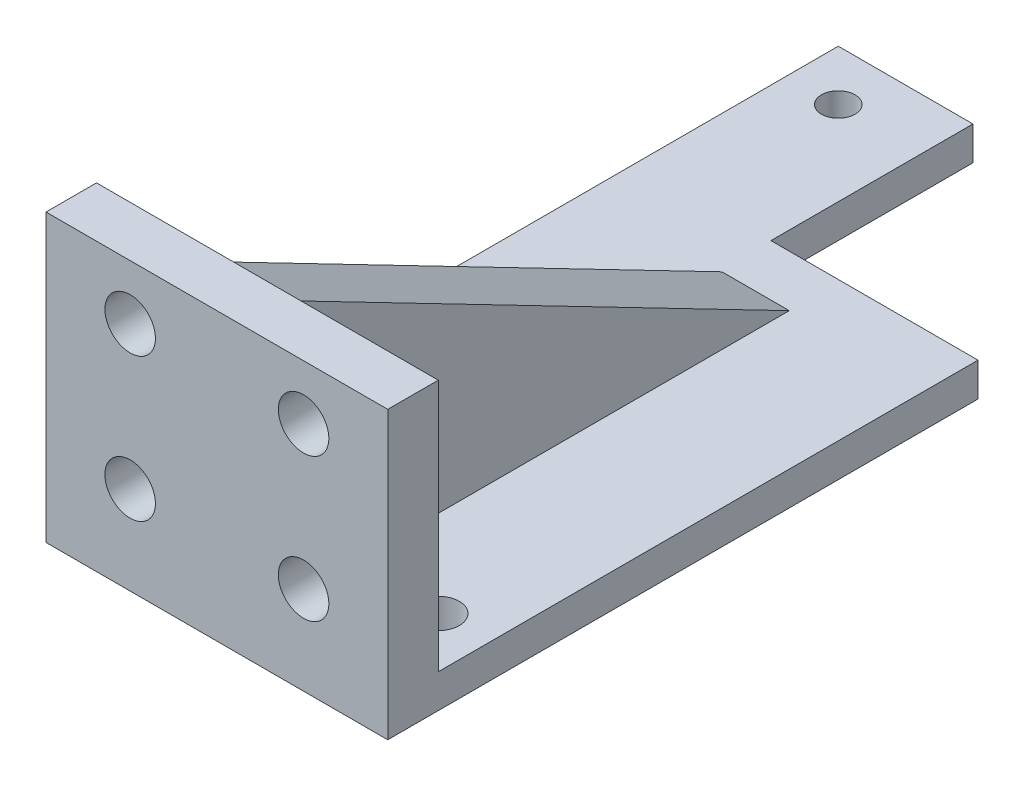
ISO-10303-21;
HEADER;
FILE_DESCRIPTION(('STEP AP214'),'2;1');
FILE_NAME('part.step','',(''),(''),'','','');
FILE_SCHEMA(('AUTOMOTIVE_DESIGN { 1 0 10303 214 1 1 1 1 }'));
ENDSEC;
DATA;
#1=APPLICATION_CONTEXT('core data for automotive mechanical design processes');
#2=APPLICATION_PROTOCOL_DEFINITION('international standard','automotive_design',2000,#1);
#3=PRODUCT_CONTEXT('',#1,'mechanical');
#4=PRODUCT('Part','Part','',(#3));
#5=PRODUCT_RELATED_PRODUCT_CATEGORY('part','',(#4));
#6=PRODUCT_DEFINITION_FORMATION('','',#4);
#7=PRODUCT_DEFINITION_CONTEXT('part definition',#1,'design');
#8=PRODUCT_DEFINITION('design','',#6,#7);
#9=PRODUCT_DEFINITION_SHAPE('','',#8);
#10=(LENGTH_UNIT() NAMED_UNIT(*) SI_UNIT(.MILLI.,.METRE.));
#11=(NAMED_UNIT(*) PLANE_ANGLE_UNIT() SI_UNIT($,.RADIAN.));
#12=(NAMED_UNIT(*) SI_UNIT($,.STERADIAN.) SOLID_ANGLE_UNIT());
#13=UNCERTAINTY_MEASURE_WITH_UNIT(LENGTH_MEASURE(1.E-05),#10,'distance_accuracy_value','');
#14=(GEOMETRIC_REPRESENTATION_CONTEXT(3) GLOBAL_UNCERTAINTY_ASSIGNED_CONTEXT((#13)) GLOBAL_UNIT_ASSIGNED_CONTEXT((#10,
#11,#12)) REPRESENTATION_CONTEXT('',''));
#15=CARTESIAN_POINT('',(0.,0.,0.));
#16=DIRECTION('',(0.,0.,1.));
#17=DIRECTION('',(1.,0.,0.));
#18=AXIS2_PLACEMENT_3D('',#15,#16,#17);
#19=CARTESIAN_POINT('',(0.,2.,0.));
#20=DIRECTION('',(0.,1.,0.));
#21=DIRECTION('',(0.,0.,1.));
#22=AXIS2_PLACEMENT_3D('',#19,#20,#21);
#23=PLANE('',#22);
#24=CARTESIAN_POINT('',(17.3,2.,-6.));
#25=DIRECTION('',(0.,1.,0.));
#26=DIRECTION('',(0.,0.,1.));
#27=AXIS2_PLACEMENT_3D('',#24,#25,#26);
#28=CIRCLE('',#27,1.25);
#29=CARTESIAN_POINT('',(17.3,2.,-4.75));
#30=VERTEX_POINT('',#29);
#31=EDGE_CURVE('E172',#30,#30,#28,.T.);
#32=ORIENTED_EDGE('',*,*,#31,.F.);
#33=EDGE_LOOP('',(#32));
#34=FACE_BOUND('',#33,.T.);
#35=CARTESIAN_POINT('',(3.,2.,-44.06));
#36=DIRECTION('',(0.,1.,0.));
#37=DIRECTION('',(0.,0.,1.));
#38=AXIS2_PLACEMENT_3D('',#35,#36,#37);
#39=CIRCLE('',#38,1.);
#40=CARTESIAN_POINT('',(3.,2.,-43.06));
#41=VERTEX_POINT('',#40);
#42=EDGE_CURVE('E212',#41,#41,#39,.T.);
#43=ORIENTED_EDGE('',*,*,#42,.F.);
#44=EDGE_LOOP('',(#43));
#45=FACE_BOUND('',#44,.T.);
#46=DIRECTION('',(1.,0.,0.));
#47=VECTOR('',#46,1.);
#48=CARTESIAN_POINT('',(0.,2.,-3.));
#49=LINE('',#48,#47);
#50=CARTESIAN_POINT('',(0.,2.,-3.));
#51=VERTEX_POINT('',#50);
#52=CARTESIAN_POINT('',(8.15,2.,-3.));
#53=VERTEX_POINT('',#52);
#54=EDGE_CURVE('E201',#51,#53,#49,.T.);
#55=ORIENTED_EDGE('',*,*,#54,.T.);
#56=DIRECTION('',(0.,0.,1.));
#57=VECTOR('',#56,1.);
#58=CARTESIAN_POINT('',(8.15,2.,-3.));
#59=LINE('',#58,#57);
#60=CARTESIAN_POINT('',(8.15,2.,-32.0005088874879));
#61=VERTEX_POINT('',#60);
#62=EDGE_CURVE('E62',#61,#53,#59,.T.);
#63=ORIENTED_EDGE('',*,*,#62,.F.);
#64=DIRECTION('',(1.,0.,0.));
#65=VECTOR('',#64,1.);
#66=CARTESIAN_POINT('',(8.15,2.,-32.0005088874879));
#67=LINE('',#66,#65);
#68=CARTESIAN_POINT('',(12.15,2.,-32.0005088874879));
#69=VERTEX_POINT('',#68);
#70=EDGE_CURVE('E67',#61,#69,#67,.T.);
#71=ORIENTED_EDGE('',*,*,#70,.T.);
#72=DIRECTION('',(0.,0.,1.));
#73=VECTOR('',#72,1.);
#74=CARTESIAN_POINT('',(12.15,2.,-3.));
#75=LINE('',#74,#73);
#76=CARTESIAN_POINT('',(12.15,2.,-3.));
#77=VERTEX_POINT('',#76);
#78=EDGE_CURVE('E153',#69,#77,#75,.T.);
#79=ORIENTED_EDGE('',*,*,#78,.T.);
#80=CARTESIAN_POINT('',(20.3,2.,-3.));
#81=VERTEX_POINT('',#80);
#82=EDGE_CURVE('E149',#77,#81,#49,.T.);
#83=ORIENTED_EDGE('',*,*,#82,.T.);
#84=DIRECTION('',(0.,0.,-1.));
#85=VECTOR('',#84,1.);
#86=CARTESIAN_POINT('',(20.3,2.,0.));
#87=LINE('',#86,#85);
#88=CARTESIAN_POINT('',(20.3,2.,-35.06));
#89=VERTEX_POINT('',#88);
#90=EDGE_CURVE('E221',#81,#89,#87,.T.);
#91=ORIENTED_EDGE('',*,*,#90,.T.);
#92=DIRECTION('',(1.,0.,0.));
#93=VECTOR('',#92,1.);
#94=CARTESIAN_POINT('',(0.,2.,-35.06));
#95=LINE('',#94,#93);
#96=CARTESIAN_POINT('',(8.,2.,-35.06));
#97=VERTEX_POINT('',#96);
#98=EDGE_CURVE('E223',#97,#89,#95,.T.);
#99=ORIENTED_EDGE('',*,*,#98,.F.);
#100=DIRECTION('',(0.,0.,1.));
#101=VECTOR('',#100,1.);
#102=CARTESIAN_POINT('',(8.00000000000001,2.,0.));
#103=LINE('',#102,#101);
#104=CARTESIAN_POINT('',(8.,2.,-47.06));
#105=VERTEX_POINT('',#104);
#106=EDGE_CURVE('E226',#105,#97,#103,.T.);
#107=ORIENTED_EDGE('',*,*,#106,.F.);
#108=DIRECTION('',(1.,0.,0.));
#109=VECTOR('',#108,1.);
#110=CARTESIAN_POINT('',(0.,2.,-47.06));
#111=LINE('',#110,#109);
#112=CARTESIAN_POINT('',(0.,2.,-47.06));
#113=VERTEX_POINT('',#112);
#114=EDGE_CURVE('E215',#113,#105,#111,.T.);
#115=ORIENTED_EDGE('',*,*,#114,.F.);
#116=DIRECTION('',(0.,0.,-1.));
#117=VECTOR('',#116,1.);
#118=CARTESIAN_POINT('',(0.,2.,0.));
#119=LINE('',#118,#117);
#120=EDGE_CURVE('E219',#51,#113,#119,.T.);
#121=ORIENTED_EDGE('',*,*,#120,.F.);
#122=EDGE_LOOP('',(#55,#63,#71,#79,#83,#91,#99,#107,#115,#121));
#123=FACE_BOUND('',#122,.T.);
#124=ADVANCED_FACE('F47',(#34,#45,#123),#23,.T.);
#125=CARTESIAN_POINT('',(0.,17.,-3.));
#126=DIRECTION('',(0.,0.,-1.));
#127=DIRECTION('',(-1.,0.,0.));
#128=AXIS2_PLACEMENT_3D('',#125,#126,#127);
#129=PLANE('',#128);
#130=CARTESIAN_POINT('',(5.,5.25,-3.));
#131=DIRECTION('',(0.,0.,-1.));
#132=DIRECTION('',(1.,0.,0.));
#133=AXIS2_PLACEMENT_3D('',#130,#131,#132);
#134=CIRCLE('',#133,1.5);
#135=CARTESIAN_POINT('',(6.5,5.25,-3.));
#136=VERTEX_POINT('',#135);
#137=EDGE_CURVE('E175',#136,#136,#134,.T.);
#138=ORIENTED_EDGE('',*,*,#137,.F.);
#139=EDGE_LOOP('',(#138));
#140=FACE_BOUND('',#139,.T.);
#141=CARTESIAN_POINT('',(5.,13.75,-3.));
#142=DIRECTION('',(0.,0.,-1.));
#143=DIRECTION('',(-1.,0.,0.));
#144=AXIS2_PLACEMENT_3D('',#141,#142,#143);
#145=CIRCLE('',#144,1.5);
#146=CARTESIAN_POINT('',(3.5,13.75,-3.));
#147=VERTEX_POINT('',#146);
#148=EDGE_CURVE('E178',#147,#147,#145,.T.);
#149=ORIENTED_EDGE('',*,*,#148,.F.);
#150=EDGE_LOOP('',(#149));
#151=FACE_BOUND('',#150,.T.);
#152=DIRECTION('',(1.,0.,0.));
#153=VECTOR('',#152,1.);
#154=CARTESIAN_POINT('',(0.,17.,-3.));
#155=LINE('',#154,#153);
#156=CARTESIAN_POINT('',(0.,17.,-3.));
#157=VERTEX_POINT('',#156);
#158=CARTESIAN_POINT('',(8.15,17.,-3.));
#159=VERTEX_POINT('',#158);
#160=EDGE_CURVE('E141',#157,#159,#155,.T.);
#161=ORIENTED_EDGE('',*,*,#160,.T.);
#162=DIRECTION('',(0.,1.,0.));
#163=VECTOR('',#162,1.);
#164=CARTESIAN_POINT('',(8.15,17.,-3.));
#165=LINE('',#164,#163);
#166=EDGE_CURVE('E160',#53,#159,#165,.T.);
#167=ORIENTED_EDGE('',*,*,#166,.F.);
#168=ORIENTED_EDGE('',*,*,#54,.F.);
#169=DIRECTION('',(0.,-1.,0.));
#170=VECTOR('',#169,1.);
#171=CARTESIAN_POINT('',(0.,17.,-3.));
#172=LINE('',#171,#170);
#173=EDGE_CURVE('E206',#157,#51,#172,.T.);
#174=ORIENTED_EDGE('',*,*,#173,.F.);
#175=EDGE_LOOP('',(#161,#167,#168,#174));
#176=FACE_BOUND('',#175,.T.);
#177=ADVANCED_FACE('F285',(#140,#151,#176),#129,.T.);
#178=CARTESIAN_POINT('',(0.,2.,-47.06));
#179=DIRECTION('',(0.,0.,-1.));
#180=DIRECTION('',(-1.,0.,0.));
#181=AXIS2_PLACEMENT_3D('',#178,#179,#180);
#182=PLANE('',#181);
#183=DIRECTION('',(1.,0.,0.));
#184=VECTOR('',#183,1.);
#185=CARTESIAN_POINT('',(0.,0.,-47.06));
#186=LINE('',#185,#184);
#187=CARTESIAN_POINT('',(0.,0.,-47.06));
#188=VERTEX_POINT('',#187);
#189=CARTESIAN_POINT('',(8.,0.,-47.06));
#190=VERTEX_POINT('',#189);
#191=EDGE_CURVE('E232',#188,#190,#186,.T.);
#192=ORIENTED_EDGE('',*,*,#191,.F.);
#193=DIRECTION('',(0.,-1.,0.));
#194=VECTOR('',#193,1.);
#195=CARTESIAN_POINT('',(0.,2.,-47.06));
#196=LINE('',#195,#194);
#197=EDGE_CURVE('E11',#113,#188,#196,.T.);
#198=ORIENTED_EDGE('',*,*,#197,.F.);
#199=ORIENTED_EDGE('',*,*,#114,.T.);
#200=DIRECTION('',(0.,-1.,0.));
#201=VECTOR('',#200,1.);
#202=CARTESIAN_POINT('',(8.,2.,-47.06));
#203=LINE('',#202,#201);
#204=EDGE_CURVE('E229',#105,#190,#203,.T.);
#205=ORIENTED_EDGE('',*,*,#204,.T.);
#206=EDGE_LOOP('',(#192,#198,#199,#205));
#207=FACE_BOUND('',#206,.T.);
#208=ADVANCED_FACE('F270',(#207),#182,.T.);
#209=CARTESIAN_POINT('',(0.,2.,0.));
#210=DIRECTION('',(-1.,0.,0.));
#211=DIRECTION('',(0.,0.,1.));
#212=AXIS2_PLACEMENT_3D('',#209,#210,#211);
#213=PLANE('',#212);
#214=DIRECTION('',(0.,0.,-1.));
#215=VECTOR('',#214,1.);
#216=CARTESIAN_POINT('',(0.,0.,0.));
#217=LINE('',#216,#215);
#218=CARTESIAN_POINT('',(0.,0.,0.));
#219=VERTEX_POINT('',#218);
#220=EDGE_CURVE('E235',#219,#188,#217,.T.);
#221=ORIENTED_EDGE('',*,*,#220,.F.);
#222=DIRECTION('',(0.,-1.,0.));
#223=VECTOR('',#222,1.);
#224=CARTESIAN_POINT('',(0.,2.,0.));
#225=LINE('',#224,#223);
#226=CARTESIAN_POINT('',(0.,17.,0.));
#227=VERTEX_POINT('',#226);
#228=EDGE_CURVE('E55',#227,#219,#225,.T.);
#229=ORIENTED_EDGE('',*,*,#228,.F.);
#230=DIRECTION('',(0.,0.,-1.));
#231=VECTOR('',#230,1.);
#232=CARTESIAN_POINT('',(0.,17.,0.));
#233=LINE('',#232,#231);
#234=EDGE_CURVE('E142',#227,#157,#233,.T.);
#235=ORIENTED_EDGE('',*,*,#234,.T.);
#236=ORIENTED_EDGE('',*,*,#173,.T.);
#237=ORIENTED_EDGE('',*,*,#120,.T.);
#238=ORIENTED_EDGE('',*,*,#197,.T.);
#239=EDGE_LOOP('',(#221,#229,#235,#236,#237,#238));
#240=FACE_BOUND('',#239,.T.);
#241=ADVANCED_FACE('F264',(#240),#213,.T.);
#242=CARTESIAN_POINT('',(0.,2.,0.));
#243=DIRECTION('',(0.,0.,-1.));
#244=DIRECTION('',(-1.,0.,0.));
#245=AXIS2_PLACEMENT_3D('',#242,#243,#244);
#246=PLANE('',#245);
#247=CARTESIAN_POINT('',(15.3,5.25,0.));
#248=DIRECTION('',(0.,0.,-1.));
#249=DIRECTION('',(-1.,0.,0.));
#250=AXIS2_PLACEMENT_3D('',#247,#248,#249);
#251=CIRCLE('',#250,1.5);
#252=CARTESIAN_POINT('',(13.8,5.25,0.));
#253=VERTEX_POINT('',#252);
#254=EDGE_CURVE('E196',#253,#253,#251,.T.);
#255=ORIENTED_EDGE('',*,*,#254,.T.);
#256=EDGE_LOOP('',(#255));
#257=FACE_BOUND('',#256,.T.);
#258=CARTESIAN_POINT('',(5.,13.75,0.));
#259=DIRECTION('',(0.,0.,-1.));
#260=DIRECTION('',(-1.,0.,0.));
#261=AXIS2_PLACEMENT_3D('',#258,#259,#260);
#262=CIRCLE('',#261,1.5);
#263=CARTESIAN_POINT('',(3.5,13.75,0.));
#264=VERTEX_POINT('',#263);
#265=EDGE_CURVE('E193',#264,#264,#262,.T.);
#266=ORIENTED_EDGE('',*,*,#265,.T.);
#267=EDGE_LOOP('',(#266));
#268=FACE_BOUND('',#267,.T.);
#269=CARTESIAN_POINT('',(5.,5.25,0.));
#270=DIRECTION('',(0.,0.,-1.));
#271=DIRECTION('',(-1.,0.,0.));
#272=AXIS2_PLACEMENT_3D('',#269,#270,#271);
#273=CIRCLE('',#272,1.5);
#274=CARTESIAN_POINT('',(3.5,5.25,0.));
#275=VERTEX_POINT('',#274);
#276=EDGE_CURVE('E190',#275,#275,#273,.T.);
#277=ORIENTED_EDGE('',*,*,#276,.T.);
#278=EDGE_LOOP('',(#277));
#279=FACE_BOUND('',#278,.T.);
#280=CARTESIAN_POINT('',(15.3,13.75,0.));
#281=DIRECTION('',(0.,0.,-1.));
#282=DIRECTION('',(-1.,0.,0.));
#283=AXIS2_PLACEMENT_3D('',#280,#281,#282);
#284=CIRCLE('',#283,1.5);
#285=CARTESIAN_POINT('',(13.8,13.75,0.));
#286=VERTEX_POINT('',#285);
#287=EDGE_CURVE('E187',#286,#286,#284,.T.);
#288=ORIENTED_EDGE('',*,*,#287,.T.);
#289=EDGE_LOOP('',(#288));
#290=FACE_BOUND('',#289,.T.);
#291=DIRECTION('',(1.,0.,0.));
#292=VECTOR('',#291,1.);
#293=CARTESIAN_POINT('',(0.,0.,0.));
#294=LINE('',#293,#292);
#295=CARTESIAN_POINT('',(20.3,0.,0.));
#296=VERTEX_POINT('',#295);
#297=EDGE_CURVE('E238',#219,#296,#294,.T.);
#298=ORIENTED_EDGE('',*,*,#297,.T.);
#299=DIRECTION('',(0.,-1.,0.));
#300=VECTOR('',#299,1.);
#301=CARTESIAN_POINT('',(20.3,2.,0.));
#302=LINE('',#301,#300);
#303=CARTESIAN_POINT('',(20.3,17.,0.));
#304=VERTEX_POINT('',#303);
#305=EDGE_CURVE('E254',#304,#296,#302,.T.);
#306=ORIENTED_EDGE('',*,*,#305,.F.);
#307=DIRECTION('',(-1.,0.,0.));
#308=VECTOR('',#307,1.);
#309=CARTESIAN_POINT('',(20.3,17.,0.));
#310=LINE('',#309,#308);
#311=EDGE_CURVE('E200',#304,#227,#310,.T.);
#312=ORIENTED_EDGE('',*,*,#311,.T.);
#313=ORIENTED_EDGE('',*,*,#228,.T.);
#314=EDGE_LOOP('',(#298,#306,#312,#313));
#315=FACE_BOUND('',#314,.T.);
#316=ADVANCED_FACE('F258',(#257,#268,#279,#290,#315),#246,.F.);
#317=CARTESIAN_POINT('',(20.3,2.,0.));
#318=DIRECTION('',(-1.,0.,0.));
#319=DIRECTION('',(0.,0.,1.));
#320=AXIS2_PLACEMENT_3D('',#317,#318,#319);
#321=PLANE('',#320);
#322=DIRECTION('',(0.,0.,-1.));
#323=VECTOR('',#322,1.);
#324=CARTESIAN_POINT('',(20.3,0.,0.));
#325=LINE('',#324,#323);
#326=CARTESIAN_POINT('',(20.3,0.,-35.06));
#327=VERTEX_POINT('',#326);
#328=EDGE_CURVE('E241',#296,#327,#325,.T.);
#329=ORIENTED_EDGE('',*,*,#328,.T.);
#330=DIRECTION('',(0.,-1.,0.));
#331=VECTOR('',#330,1.);
#332=CARTESIAN_POINT('',(20.3,2.,-35.06));
#333=LINE('',#332,#331);
#334=EDGE_CURVE('E252',#89,#327,#333,.T.);
#335=ORIENTED_EDGE('',*,*,#334,.F.);
#336=ORIENTED_EDGE('',*,*,#90,.F.);
#337=DIRECTION('',(0.,-1.,0.));
#338=VECTOR('',#337,1.);
#339=CARTESIAN_POINT('',(20.3,17.,-3.));
#340=LINE('',#339,#338);
#341=CARTESIAN_POINT('',(20.3,17.,-3.));
#342=VERTEX_POINT('',#341);
#343=EDGE_CURVE('E208',#342,#81,#340,.T.);
#344=ORIENTED_EDGE('',*,*,#343,.F.);
#345=DIRECTION('',(0.,0.,1.));
#346=VECTOR('',#345,1.);
#347=CARTESIAN_POINT('',(20.3,17.,-3.));
#348=LINE('',#347,#346);
#349=EDGE_CURVE('E137',#342,#304,#348,.T.);
#350=ORIENTED_EDGE('',*,*,#349,.T.);
#351=ORIENTED_EDGE('',*,*,#305,.T.);
#352=EDGE_LOOP('',(#329,#335,#336,#344,#350,#351));
#353=FACE_BOUND('',#352,.T.);
#354=ADVANCED_FACE('F282',(#353),#321,.F.);
#355=CARTESIAN_POINT('',(0.,2.,-35.06));
#356=DIRECTION('',(0.,0.,-1.));
#357=DIRECTION('',(-1.,0.,0.));
#358=AXIS2_PLACEMENT_3D('',#355,#356,#357);
#359=PLANE('',#358);
#360=DIRECTION('',(1.,0.,0.));
#361=VECTOR('',#360,1.);
#362=CARTESIAN_POINT('',(0.,0.,-35.06));
#363=LINE('',#362,#361);
#364=CARTESIAN_POINT('',(8.,0.,-35.06));
#365=VERTEX_POINT('',#364);
#366=EDGE_CURVE('E244',#365,#327,#363,.T.);
#367=ORIENTED_EDGE('',*,*,#366,.F.);
#368=DIRECTION('',(0.,-1.,0.));
#369=VECTOR('',#368,1.);
#370=CARTESIAN_POINT('',(8.,2.,-35.06));
#371=LINE('',#370,#369);
#372=EDGE_CURVE('E250',#97,#365,#371,.T.);
#373=ORIENTED_EDGE('',*,*,#372,.F.);
#374=ORIENTED_EDGE('',*,*,#98,.T.);
#375=ORIENTED_EDGE('',*,*,#334,.T.);
#376=EDGE_LOOP('',(#367,#373,#374,#375));
#377=FACE_BOUND('',#376,.T.);
#378=ADVANCED_FACE('F278',(#377),#359,.T.);
#379=CARTESIAN_POINT('',(3.,2.,-44.06));
#380=DIRECTION('',(0.,-1.,0.));
#381=DIRECTION('',(0.,0.,-1.));
#382=AXIS2_PLACEMENT_3D('',#379,#380,#381);
#383=CYLINDRICAL_SURFACE('',#382,1.);
#384=ORIENTED_EDGE('',*,*,#42,.T.);
#385=EDGE_LOOP('',(#384));
#386=FACE_BOUND('',#385,.T.);
#387=CARTESIAN_POINT('',(3.,0.,-44.06));
#388=DIRECTION('',(0.,1.,0.));
#389=DIRECTION('',(0.,0.,1.));
#390=AXIS2_PLACEMENT_3D('',#387,#388,#389);
#391=CIRCLE('',#390,1.);
#392=CARTESIAN_POINT('',(3.,0.,-43.06));
#393=VERTEX_POINT('',#392);
#394=EDGE_CURVE('E210',#393,#393,#391,.T.);
#395=ORIENTED_EDGE('',*,*,#394,.F.);
#396=EDGE_LOOP('',(#395));
#397=FACE_BOUND('',#396,.T.);
#398=ADVANCED_FACE('F49',(#386,#397),#383,.F.);
#399=CARTESIAN_POINT('',(8.00000000000001,2.,0.));
#400=DIRECTION('',(1.,0.,0.));
#401=DIRECTION('',(0.,0.,-1.));
#402=AXIS2_PLACEMENT_3D('',#399,#400,#401);
#403=PLANE('',#402);
#404=DIRECTION('',(0.,0.,1.));
#405=VECTOR('',#404,1.);
#406=CARTESIAN_POINT('',(8.00000000000001,0.,0.));
#407=LINE('',#406,#405);
#408=EDGE_CURVE('E216',#190,#365,#407,.T.);
#409=ORIENTED_EDGE('',*,*,#408,.F.);
#410=ORIENTED_EDGE('',*,*,#204,.F.);
#411=ORIENTED_EDGE('',*,*,#106,.T.);
#412=ORIENTED_EDGE('',*,*,#372,.T.);
#413=EDGE_LOOP('',(#409,#410,#411,#412));
#414=FACE_BOUND('',#413,.T.);
#415=ADVANCED_FACE('F273',(#414),#403,.T.);
#416=CARTESIAN_POINT('',(0.,0.,0.));
#417=DIRECTION('',(0.,1.,0.));
#418=DIRECTION('',(0.,0.,1.));
#419=AXIS2_PLACEMENT_3D('',#416,#417,#418);
#420=PLANE('',#419);
#421=CARTESIAN_POINT('',(17.3,0.,-6.));
#422=DIRECTION('',(0.,-1.,0.));
#423=DIRECTION('',(0.,0.,-1.));
#424=AXIS2_PLACEMENT_3D('',#421,#422,#423);
#425=CIRCLE('',#424,1.25);
#426=CARTESIAN_POINT('',(17.3,0.,-7.25));
#427=VERTEX_POINT('',#426);
#428=EDGE_CURVE('E169',#427,#427,#425,.T.);
#429=ORIENTED_EDGE('',*,*,#428,.F.);
#430=EDGE_LOOP('',(#429));
#431=FACE_BOUND('',#430,.T.);
#432=ORIENTED_EDGE('',*,*,#394,.T.);
#433=EDGE_LOOP('',(#432));
#434=FACE_BOUND('',#433,.T.);
#435=ORIENTED_EDGE('',*,*,#191,.T.);
#436=ORIENTED_EDGE('',*,*,#408,.T.);
#437=ORIENTED_EDGE('',*,*,#366,.T.);
#438=ORIENTED_EDGE('',*,*,#328,.F.);
#439=ORIENTED_EDGE('',*,*,#297,.F.);
#440=ORIENTED_EDGE('',*,*,#220,.T.);
#441=EDGE_LOOP('',(#435,#436,#437,#438,#439,#440));
#442=FACE_BOUND('',#441,.T.);
#443=ADVANCED_FACE('F263',(#431,#434,#442),#420,.F.);
#444=DIRECTION('',(0.,1.,0.));
#445=VECTOR('',#444,1.);
#446=CARTESIAN_POINT('',(12.15,17.,-3.));
#447=LINE('',#446,#445);
#448=CARTESIAN_POINT('',(12.15,17.,-3.));
#449=VERTEX_POINT('',#448);
#450=EDGE_CURVE('E146',#77,#449,#447,.T.);
#451=ORIENTED_EDGE('',*,*,#450,.T.);
#452=EDGE_CURVE('E128',#449,#342,#155,.T.);
#453=ORIENTED_EDGE('',*,*,#452,.T.);
#454=ORIENTED_EDGE('',*,*,#343,.T.);
#455=ORIENTED_EDGE('',*,*,#82,.F.);
#456=EDGE_LOOP('',(#451,#453,#454,#455));
#457=FACE_BOUND('',#456,.T.);
#458=CARTESIAN_POINT('',(15.3,5.25,-3.));
#459=DIRECTION('',(0.,0.,-1.));
#460=DIRECTION('',(1.,0.,0.));
#461=AXIS2_PLACEMENT_3D('',#458,#459,#460);
#462=CIRCLE('',#461,1.5);
#463=CARTESIAN_POINT('',(16.8,5.25,-3.));
#464=VERTEX_POINT('',#463);
#465=EDGE_CURVE('E179',#464,#464,#462,.T.);
#466=ORIENTED_EDGE('',*,*,#465,.F.);
#467=EDGE_LOOP('',(#466));
#468=FACE_BOUND('',#467,.T.);
#469=CARTESIAN_POINT('',(15.3,13.75,-3.));
#470=DIRECTION('',(0.,0.,-1.));
#471=DIRECTION('',(-1.,0.,0.));
#472=AXIS2_PLACEMENT_3D('',#469,#470,#471);
#473=CIRCLE('',#472,1.5);
#474=CARTESIAN_POINT('',(13.8,13.75,-3.));
#475=VERTEX_POINT('',#474);
#476=EDGE_CURVE('E182',#475,#475,#473,.T.);
#477=ORIENTED_EDGE('',*,*,#476,.F.);
#478=EDGE_LOOP('',(#477));
#479=FACE_BOUND('',#478,.T.);
#480=ADVANCED_FACE('F147',(#457,#468,#479),#129,.T.);
#481=CARTESIAN_POINT('',(0.,17.,0.));
#482=DIRECTION('',(0.,-1.,0.));
#483=DIRECTION('',(0.,0.,-1.));
#484=AXIS2_PLACEMENT_3D('',#481,#482,#483);
#485=PLANE('',#484);
#486=ORIENTED_EDGE('',*,*,#349,.F.);
#487=ORIENTED_EDGE('',*,*,#452,.F.);
#488=DIRECTION('',(1.,0.,0.));
#489=VECTOR('',#488,1.);
#490=CARTESIAN_POINT('',(8.15,17.,-3.));
#491=LINE('',#490,#489);
#492=EDGE_CURVE('E133',#159,#449,#491,.T.);
#493=ORIENTED_EDGE('',*,*,#492,.F.);
#494=ORIENTED_EDGE('',*,*,#160,.F.);
#495=ORIENTED_EDGE('',*,*,#234,.F.);
#496=ORIENTED_EDGE('',*,*,#311,.F.);
#497=EDGE_LOOP('',(#486,#487,#493,#494,#495,#496));
#498=FACE_BOUND('',#497,.T.);
#499=ADVANCED_FACE('F130',(#498),#485,.F.);
#500=CARTESIAN_POINT('',(15.3,13.75,12.));
#501=DIRECTION('',(0.,0.,-1.));
#502=DIRECTION('',(-1.,0.,0.));
#503=AXIS2_PLACEMENT_3D('',#500,#501,#502);
#504=CYLINDRICAL_SURFACE('',#503,1.5);
#505=ORIENTED_EDGE('',*,*,#476,.T.);
#506=EDGE_LOOP('',(#505));
#507=FACE_BOUND('',#506,.T.);
#508=ORIENTED_EDGE('',*,*,#287,.F.);
#509=EDGE_LOOP('',(#508));
#510=FACE_BOUND('',#509,.T.);
#511=ADVANCED_FACE('F361',(#507,#510),#504,.F.);
#512=CARTESIAN_POINT('',(5.,5.25,12.));
#513=DIRECTION('',(0.,0.,-1.));
#514=DIRECTION('',(-1.,0.,0.));
#515=AXIS2_PLACEMENT_3D('',#512,#513,#514);
#516=CYLINDRICAL_SURFACE('',#515,1.5);
#517=ORIENTED_EDGE('',*,*,#137,.T.);
#518=EDGE_LOOP('',(#517));
#519=FACE_BOUND('',#518,.T.);
#520=ORIENTED_EDGE('',*,*,#276,.F.);
#521=EDGE_LOOP('',(#520));
#522=FACE_BOUND('',#521,.T.);
#523=ADVANCED_FACE('F367',(#519,#522),#516,.F.);
#524=CARTESIAN_POINT('',(5.,13.75,12.));
#525=DIRECTION('',(0.,0.,-1.));
#526=DIRECTION('',(-1.,0.,0.));
#527=AXIS2_PLACEMENT_3D('',#524,#525,#526);
#528=CYLINDRICAL_SURFACE('',#527,1.5);
#529=ORIENTED_EDGE('',*,*,#148,.T.);
#530=EDGE_LOOP('',(#529));
#531=FACE_BOUND('',#530,.T.);
#532=ORIENTED_EDGE('',*,*,#265,.F.);
#533=EDGE_LOOP('',(#532));
#534=FACE_BOUND('',#533,.T.);
#535=ADVANCED_FACE('F375',(#531,#534),#528,.F.);
#536=CARTESIAN_POINT('',(15.3,5.25,12.));
#537=DIRECTION('',(0.,0.,-1.));
#538=DIRECTION('',(-1.,0.,0.));
#539=AXIS2_PLACEMENT_3D('',#536,#537,#538);
#540=CYLINDRICAL_SURFACE('',#539,1.5);
#541=ORIENTED_EDGE('',*,*,#465,.T.);
#542=EDGE_LOOP('',(#541));
#543=FACE_BOUND('',#542,.T.);
#544=ORIENTED_EDGE('',*,*,#254,.F.);
#545=EDGE_LOOP('',(#544));
#546=FACE_BOUND('',#545,.T.);
#547=ADVANCED_FACE('F383',(#543,#546),#540,.F.);
#548=CARTESIAN_POINT('',(17.3,10.,-6.));
#549=DIRECTION('',(0.,-1.,0.));
#550=DIRECTION('',(0.,0.,-1.));
#551=AXIS2_PLACEMENT_3D('',#548,#549,#550);
#552=CYLINDRICAL_SURFACE('',#551,1.25);
#553=ORIENTED_EDGE('',*,*,#31,.T.);
#554=EDGE_LOOP('',(#553));
#555=FACE_BOUND('',#554,.T.);
#556=ORIENTED_EDGE('',*,*,#428,.T.);
#557=EDGE_LOOP('',(#556));
#558=FACE_BOUND('',#557,.T.);
#559=ADVANCED_FACE('F390',(#555,#558),#552,.F.);
#560=CARTESIAN_POINT('',(8.15,2.,-32.0005088874879));
#561=DIRECTION('',(0.,-0.888220932879966,0.459416558684864));
#562=DIRECTION('',(0.,-0.459416558684864,-0.888220932879966));
#563=AXIS2_PLACEMENT_3D('',#560,#561,#562);
#564=PLANE('',#563);
#565=DIRECTION('',(0.,-0.459416558684864,-0.888220932879966));
#566=VECTOR('',#565,1.);
#567=CARTESIAN_POINT('',(12.15,2.,-32.0005088874879));
#568=LINE('',#567,#566);
#569=EDGE_CURVE('E159',#449,#69,#568,.T.);
#570=ORIENTED_EDGE('',*,*,#569,.T.);
#571=ORIENTED_EDGE('',*,*,#70,.F.);
#572=DIRECTION('',(0.,-0.459416558684864,-0.888220932879966));
#573=VECTOR('',#572,1.);
#574=CARTESIAN_POINT('',(8.15,2.,-32.0005088874879));
#575=LINE('',#574,#573);
#576=EDGE_CURVE('E152',#159,#61,#575,.T.);
#577=ORIENTED_EDGE('',*,*,#576,.F.);
#578=ORIENTED_EDGE('',*,*,#492,.T.);
#579=EDGE_LOOP('',(#570,#571,#577,#578));
#580=FACE_BOUND('',#579,.T.);
#581=ADVANCED_FACE('F158',(#580),#564,.F.);
#582=CARTESIAN_POINT('',(8.15,0.,0.));
#583=DIRECTION('',(1.,0.,0.));
#584=DIRECTION('',(0.,0.,-1.));
#585=AXIS2_PLACEMENT_3D('',#582,#583,#584);
#586=PLANE('',#585);
#587=ORIENTED_EDGE('',*,*,#576,.T.);
#588=ORIENTED_EDGE('',*,*,#62,.T.);
#589=ORIENTED_EDGE('',*,*,#166,.T.);
#590=EDGE_LOOP('',(#587,#588,#589));
#591=FACE_BOUND('',#590,.T.);
#592=ADVANCED_FACE('F403',(#591),#586,.F.);
#593=CARTESIAN_POINT('',(12.15,0.,0.));
#594=DIRECTION('',(1.,0.,0.));
#595=DIRECTION('',(0.,0.,-1.));
#596=AXIS2_PLACEMENT_3D('',#593,#594,#595);
#597=PLANE('',#596);
#598=ORIENTED_EDGE('',*,*,#569,.F.);
#599=ORIENTED_EDGE('',*,*,#450,.F.);
#600=ORIENTED_EDGE('',*,*,#78,.F.);
#601=EDGE_LOOP('',(#598,#599,#600));
#602=FACE_BOUND('',#601,.T.);
#603=ADVANCED_FACE('F162',(#602),#597,.T.);
#604=CLOSED_SHELL('',(#124,#177,#208,#241,#316,#354,#378,#398,#415,#443,#480,#499,#511,#523,
#535,#547,#559,#581,#592,#603));
#605=MANIFOLD_SOLID_BREP('B2',#604);
#606=ADVANCED_BREP_SHAPE_REPRESENTATION('',(#18,#605),#14);
#607=SHAPE_DEFINITION_REPRESENTATION(#9,#606);
ENDSEC;
END-ISO-10303-21;
